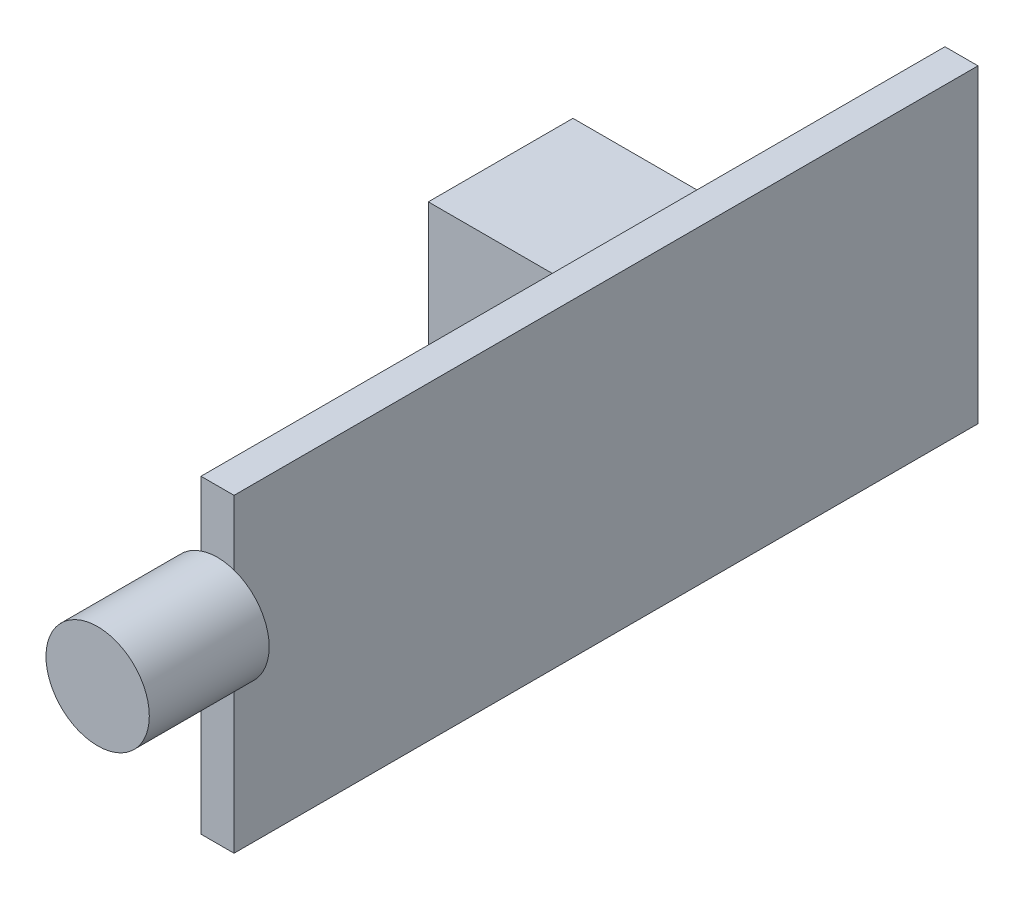
ISO-10303-21;
HEADER;
FILE_DESCRIPTION(('STEP AP214'),'2;1');
FILE_NAME('part.step','',(''),(''),'','','');
FILE_SCHEMA(('AUTOMOTIVE_DESIGN { 1 0 10303 214 1 1 1 1 }'));
ENDSEC;
DATA;
#1=APPLICATION_CONTEXT('core data for automotive mechanical design processes');
#2=APPLICATION_PROTOCOL_DEFINITION('international standard','automotive_design',2000,#1);
#3=PRODUCT_CONTEXT('',#1,'mechanical');
#4=PRODUCT('Part','Part','',(#3));
#5=PRODUCT_RELATED_PRODUCT_CATEGORY('part','',(#4));
#6=PRODUCT_DEFINITION_FORMATION('','',#4);
#7=PRODUCT_DEFINITION_CONTEXT('part definition',#1,'design');
#8=PRODUCT_DEFINITION('design','',#6,#7);
#9=PRODUCT_DEFINITION_SHAPE('','',#8);
#10=(LENGTH_UNIT() NAMED_UNIT(*) SI_UNIT(.MILLI.,.METRE.));
#11=(NAMED_UNIT(*) PLANE_ANGLE_UNIT() SI_UNIT($,.RADIAN.));
#12=(NAMED_UNIT(*) SI_UNIT($,.STERADIAN.) SOLID_ANGLE_UNIT());
#13=UNCERTAINTY_MEASURE_WITH_UNIT(LENGTH_MEASURE(1.E-05),#10,'distance_accuracy_value','');
#14=(GEOMETRIC_REPRESENTATION_CONTEXT(3) GLOBAL_UNCERTAINTY_ASSIGNED_CONTEXT((#13)) GLOBAL_UNIT_ASSIGNED_CONTEXT((#10,
#11,#12)) REPRESENTATION_CONTEXT('',''));
#15=CARTESIAN_POINT('',(0.,0.,0.));
#16=DIRECTION('',(0.,0.,1.));
#17=DIRECTION('',(1.,0.,0.));
#18=AXIS2_PLACEMENT_3D('',#15,#16,#17);
#19=CARTESIAN_POINT('',(14.2,-128.5,43.));
#20=DIRECTION('',(1.,0.,0.));
#21=DIRECTION('',(0.,0.,-1.));
#22=AXIS2_PLACEMENT_3D('',#19,#20,#21);
#23=PLANE('',#22);
#24=DIRECTION('',(0.,-1.,0.));
#25=VECTOR('',#24,1.);
#26=CARTESIAN_POINT('',(14.2,-128.5,7.));
#27=LINE('',#26,#25);
#28=CARTESIAN_POINT('',(14.2,-113.5,7.));
#29=VERTEX_POINT('',#28);
#30=CARTESIAN_POINT('',(14.2,-128.5,7.));
#31=VERTEX_POINT('',#30);
#32=EDGE_CURVE('E167',#29,#31,#27,.T.);
#33=ORIENTED_EDGE('',*,*,#32,.T.);
#34=DIRECTION('',(0.,0.,-1.));
#35=VECTOR('',#34,1.);
#36=CARTESIAN_POINT('',(14.2,-128.5,43.));
#37=LINE('',#36,#35);
#38=CARTESIAN_POINT('',(14.2,-128.5,43.));
#39=VERTEX_POINT('',#38);
#40=EDGE_CURVE('E173',#39,#31,#37,.T.);
#41=ORIENTED_EDGE('',*,*,#40,.F.);
#42=DIRECTION('',(0.,-1.,0.));
#43=VECTOR('',#42,1.);
#44=CARTESIAN_POINT('',(14.2,-128.5,43.));
#45=LINE('',#44,#43);
#46=CARTESIAN_POINT('',(14.2,-121.368543856465,43.));
#47=VERTEX_POINT('',#46);
#48=EDGE_CURVE('E155',#47,#39,#45,.T.);
#49=ORIENTED_EDGE('',*,*,#48,.F.);
#50=CARTESIAN_POINT('',(14.2,-116.631456143535,43.));
#51=VERTEX_POINT('',#50);
#52=EDGE_CURVE('E160',#51,#47,#45,.T.);
#53=ORIENTED_EDGE('',*,*,#52,.F.);
#54=CARTESIAN_POINT('',(14.2,-113.5,43.));
#55=VERTEX_POINT('',#54);
#56=EDGE_CURVE('E156',#55,#51,#45,.T.);
#57=ORIENTED_EDGE('',*,*,#56,.F.);
#58=DIRECTION('',(0.,0.,-1.));
#59=VECTOR('',#58,1.);
#60=CARTESIAN_POINT('',(14.2,-113.5,43.));
#61=LINE('',#60,#59);
#62=EDGE_CURVE('E175',#55,#29,#61,.T.);
#63=ORIENTED_EDGE('',*,*,#62,.T.);
#64=EDGE_LOOP('',(#33,#41,#49,#53,#57,#63));
#65=FACE_BOUND('',#64,.T.);
#66=DIRECTION('',(0.,1.,0.));
#67=VECTOR('',#66,1.);
#68=CARTESIAN_POINT('',(14.2,-120.5,25.));
#69=LINE('',#68,#67);
#70=CARTESIAN_POINT('',(14.2,-120.5,25.));
#71=VERTEX_POINT('',#70);
#72=CARTESIAN_POINT('',(14.2,-114.5,25.));
#73=VERTEX_POINT('',#72);
#74=EDGE_CURVE('E123',#71,#73,#69,.T.);
#75=ORIENTED_EDGE('',*,*,#74,.F.);
#76=DIRECTION('',(0.,0.,-1.));
#77=VECTOR('',#76,1.);
#78=CARTESIAN_POINT('',(14.2,-120.5,25.));
#79=LINE('',#78,#77);
#80=CARTESIAN_POINT('',(14.2,-120.5,18.));
#81=VERTEX_POINT('',#80);
#82=EDGE_CURVE('E418',#71,#81,#79,.T.);
#83=ORIENTED_EDGE('',*,*,#82,.T.);
#84=DIRECTION('',(0.,1.,0.));
#85=VECTOR('',#84,1.);
#86=CARTESIAN_POINT('',(14.2,-120.5,18.));
#87=LINE('',#86,#85);
#88=CARTESIAN_POINT('',(14.2,-114.5,18.));
#89=VERTEX_POINT('',#88);
#90=EDGE_CURVE('E136',#81,#89,#87,.T.);
#91=ORIENTED_EDGE('',*,*,#90,.T.);
#92=DIRECTION('',(0.,0.,-1.));
#93=VECTOR('',#92,1.);
#94=CARTESIAN_POINT('',(14.2,-114.5,25.));
#95=LINE('',#94,#93);
#96=EDGE_CURVE('E57',#73,#89,#95,.T.);
#97=ORIENTED_EDGE('',*,*,#96,.F.);
#98=EDGE_LOOP('',(#75,#83,#91,#97));
#99=FACE_BOUND('',#98,.T.);
#100=ADVANCED_FACE('F39',(#65,#99),#23,.F.);
#101=CARTESIAN_POINT('',(0.,0.,43.));
#102=DIRECTION('',(0.,0.,-1.));
#103=DIRECTION('',(-1.,0.,0.));
#104=AXIS2_PLACEMENT_3D('',#101,#102,#103);
#105=PLANE('',#104);
#106=CARTESIAN_POINT('',(15.,-119.,43.));
#107=DIRECTION('',(0.,0.,1.));
#108=DIRECTION('',(1.,0.,0.));
#109=AXIS2_PLACEMENT_3D('',#106,#107,#108);
#110=CIRCLE('',#109,2.5);
#111=CARTESIAN_POINT('',(15.8,-116.631456143535,43.));
#112=VERTEX_POINT('',#111);
#113=EDGE_CURVE('E49',#112,#51,#110,.T.);
#114=ORIENTED_EDGE('',*,*,#113,.F.);
#115=DIRECTION('',(0.,1.,0.));
#116=VECTOR('',#115,1.);
#117=CARTESIAN_POINT('',(15.8,-128.5,43.));
#118=LINE('',#117,#116);
#119=CARTESIAN_POINT('',(15.8,-113.5,43.));
#120=VERTEX_POINT('',#119);
#121=EDGE_CURVE('E153',#112,#120,#118,.T.);
#122=ORIENTED_EDGE('',*,*,#121,.T.);
#123=DIRECTION('',(-1.,0.,0.));
#124=VECTOR('',#123,1.);
#125=CARTESIAN_POINT('',(14.2,-113.5,43.));
#126=LINE('',#125,#124);
#127=EDGE_CURVE('E151',#120,#55,#126,.T.);
#128=ORIENTED_EDGE('',*,*,#127,.T.);
#129=ORIENTED_EDGE('',*,*,#56,.T.);
#130=EDGE_LOOP('',(#114,#122,#128,#129));
#131=FACE_BOUND('',#130,.T.);
#132=ADVANCED_FACE('F209',(#131),#105,.F.);
#133=CARTESIAN_POINT('',(15.8,-128.5,43.));
#134=DIRECTION('',(-1.,0.,0.));
#135=DIRECTION('',(0.,0.,1.));
#136=AXIS2_PLACEMENT_3D('',#133,#134,#135);
#137=PLANE('',#136);
#138=DIRECTION('',(0.,1.,0.));
#139=VECTOR('',#138,1.);
#140=CARTESIAN_POINT('',(15.8,-128.5,7.));
#141=LINE('',#140,#139);
#142=CARTESIAN_POINT('',(15.8,-128.5,7.));
#143=VERTEX_POINT('',#142);
#144=CARTESIAN_POINT('',(15.8,-113.5,7.));
#145=VERTEX_POINT('',#144);
#146=EDGE_CURVE('E146',#143,#145,#141,.T.);
#147=ORIENTED_EDGE('',*,*,#146,.T.);
#148=DIRECTION('',(0.,0.,-1.));
#149=VECTOR('',#148,1.);
#150=CARTESIAN_POINT('',(15.8,-113.5,43.));
#151=LINE('',#150,#149);
#152=EDGE_CURVE('E43',#120,#145,#151,.T.);
#153=ORIENTED_EDGE('',*,*,#152,.F.);
#154=ORIENTED_EDGE('',*,*,#121,.F.);
#155=CARTESIAN_POINT('',(15.8,-121.368543856465,43.));
#156=VERTEX_POINT('',#155);
#157=EDGE_CURVE('E152',#156,#112,#118,.T.);
#158=ORIENTED_EDGE('',*,*,#157,.F.);
#159=CARTESIAN_POINT('',(15.8,-128.5,43.));
#160=VERTEX_POINT('',#159);
#161=EDGE_CURVE('E149',#160,#156,#118,.T.);
#162=ORIENTED_EDGE('',*,*,#161,.F.);
#163=DIRECTION('',(0.,0.,-1.));
#164=VECTOR('',#163,1.);
#165=CARTESIAN_POINT('',(15.8,-128.5,43.));
#166=LINE('',#165,#164);
#167=EDGE_CURVE('E162',#160,#143,#166,.T.);
#168=ORIENTED_EDGE('',*,*,#167,.T.);
#169=EDGE_LOOP('',(#147,#153,#154,#158,#162,#168));
#170=FACE_BOUND('',#169,.T.);
#171=ADVANCED_FACE('F41',(#170),#137,.F.);
#172=CARTESIAN_POINT('',(14.2,-113.5,43.));
#173=DIRECTION('',(0.,-1.,0.));
#174=DIRECTION('',(0.,0.,-1.));
#175=AXIS2_PLACEMENT_3D('',#172,#173,#174);
#176=PLANE('',#175);
#177=DIRECTION('',(-1.,0.,0.));
#178=VECTOR('',#177,1.);
#179=CARTESIAN_POINT('',(14.2,-113.5,7.));
#180=LINE('',#179,#178);
#181=EDGE_CURVE('E165',#145,#29,#180,.T.);
#182=ORIENTED_EDGE('',*,*,#181,.T.);
#183=ORIENTED_EDGE('',*,*,#62,.F.);
#184=ORIENTED_EDGE('',*,*,#127,.F.);
#185=ORIENTED_EDGE('',*,*,#152,.T.);
#186=EDGE_LOOP('',(#182,#183,#184,#185));
#187=FACE_BOUND('',#186,.T.);
#188=ADVANCED_FACE('F185',(#187),#176,.F.);
#189=CARTESIAN_POINT('',(14.2,-128.5,43.));
#190=DIRECTION('',(0.,1.,0.));
#191=DIRECTION('',(0.,0.,1.));
#192=AXIS2_PLACEMENT_3D('',#189,#190,#191);
#193=PLANE('',#192);
#194=DIRECTION('',(1.,0.,0.));
#195=VECTOR('',#194,1.);
#196=CARTESIAN_POINT('',(14.2,-128.5,7.));
#197=LINE('',#196,#195);
#198=EDGE_CURVE('E169',#31,#143,#197,.T.);
#199=ORIENTED_EDGE('',*,*,#198,.T.);
#200=ORIENTED_EDGE('',*,*,#167,.F.);
#201=DIRECTION('',(1.,0.,0.));
#202=VECTOR('',#201,1.);
#203=CARTESIAN_POINT('',(14.2,-128.5,43.));
#204=LINE('',#203,#202);
#205=EDGE_CURVE('E159',#39,#160,#204,.T.);
#206=ORIENTED_EDGE('',*,*,#205,.F.);
#207=ORIENTED_EDGE('',*,*,#40,.T.);
#208=EDGE_LOOP('',(#199,#200,#206,#207));
#209=FACE_BOUND('',#208,.T.);
#210=ADVANCED_FACE('F197',(#209),#193,.F.);
#211=EDGE_CURVE('E11',#47,#156,#110,.T.);
#212=ORIENTED_EDGE('',*,*,#211,.F.);
#213=ORIENTED_EDGE('',*,*,#48,.T.);
#214=ORIENTED_EDGE('',*,*,#205,.T.);
#215=ORIENTED_EDGE('',*,*,#161,.T.);
#216=EDGE_LOOP('',(#212,#213,#214,#215));
#217=FACE_BOUND('',#216,.T.);
#218=ADVANCED_FACE('F198',(#217),#105,.F.);
#219=CARTESIAN_POINT('',(0.,0.,7.));
#220=DIRECTION('',(0.,0.,-1.));
#221=DIRECTION('',(-1.,0.,0.));
#222=AXIS2_PLACEMENT_3D('',#219,#220,#221);
#223=PLANE('',#222);
#224=ORIENTED_EDGE('',*,*,#146,.F.);
#225=ORIENTED_EDGE('',*,*,#198,.F.);
#226=ORIENTED_EDGE('',*,*,#32,.F.);
#227=ORIENTED_EDGE('',*,*,#181,.F.);
#228=EDGE_LOOP('',(#224,#225,#226,#227));
#229=FACE_BOUND('',#228,.T.);
#230=ADVANCED_FACE('F193',(#229),#223,.T.);
#231=CARTESIAN_POINT('',(15.,-119.,43.));
#232=DIRECTION('',(0.,0.,1.));
#233=DIRECTION('',(1.,0.,0.));
#234=AXIS2_PLACEMENT_3D('',#231,#232,#233);
#235=PLANE('',#234);
#236=EDGE_CURVE('E137',#156,#112,#110,.T.);
#237=ORIENTED_EDGE('',*,*,#236,.F.);
#238=ORIENTED_EDGE('',*,*,#157,.T.);
#239=EDGE_LOOP('',(#237,#238));
#240=FACE_BOUND('',#239,.T.);
#241=ADVANCED_FACE('F212',(#240),#235,.F.);
#242=EDGE_CURVE('E50',#51,#47,#110,.T.);
#243=ORIENTED_EDGE('',*,*,#242,.F.);
#244=ORIENTED_EDGE('',*,*,#52,.T.);
#245=EDGE_LOOP('',(#243,#244));
#246=FACE_BOUND('',#245,.T.);
#247=ADVANCED_FACE('F204',(#246),#235,.F.);
#248=CARTESIAN_POINT('',(15.,-119.,48.8));
#249=DIRECTION('',(0.,0.,-1.));
#250=DIRECTION('',(-1.,0.,0.));
#251=AXIS2_PLACEMENT_3D('',#248,#249,#250);
#252=CYLINDRICAL_SURFACE('',#251,2.5);
#253=CARTESIAN_POINT('',(15.,-119.,48.8));
#254=DIRECTION('',(0.,0.,1.));
#255=DIRECTION('',(1.,0.,0.));
#256=AXIS2_PLACEMENT_3D('',#253,#254,#255);
#257=CIRCLE('',#256,2.5);
#258=CARTESIAN_POINT('',(17.5,-119.,48.8));
#259=VERTEX_POINT('',#258);
#260=EDGE_CURVE('E144',#259,#259,#257,.T.);
#261=ORIENTED_EDGE('',*,*,#260,.F.);
#262=EDGE_LOOP('',(#261));
#263=FACE_BOUND('',#262,.T.);
#264=ORIENTED_EDGE('',*,*,#113,.T.);
#265=ORIENTED_EDGE('',*,*,#242,.T.);
#266=ORIENTED_EDGE('',*,*,#211,.T.);
#267=ORIENTED_EDGE('',*,*,#236,.T.);
#268=EDGE_LOOP('',(#264,#265,#266,#267));
#269=FACE_BOUND('',#268,.T.);
#270=ADVANCED_FACE('F206',(#263,#269),#252,.T.);
#271=CARTESIAN_POINT('',(15.,-119.,48.8));
#272=DIRECTION('',(0.,0.,1.));
#273=DIRECTION('',(1.,0.,0.));
#274=AXIS2_PLACEMENT_3D('',#271,#272,#273);
#275=PLANE('',#274);
#276=ORIENTED_EDGE('',*,*,#260,.T.);
#277=EDGE_LOOP('',(#276));
#278=FACE_BOUND('',#277,.T.);
#279=ADVANCED_FACE('F248',(#278),#275,.T.);
#280=CARTESIAN_POINT('',(7.2,-114.5,25.));
#281=DIRECTION('',(0.,-1.,0.));
#282=DIRECTION('',(0.,0.,-1.));
#283=AXIS2_PLACEMENT_3D('',#280,#281,#282);
#284=PLANE('',#283);
#285=DIRECTION('',(-1.,0.,0.));
#286=VECTOR('',#285,1.);
#287=CARTESIAN_POINT('',(7.2,-114.5,18.));
#288=LINE('',#287,#286);
#289=CARTESIAN_POINT('',(7.2,-114.5,18.));
#290=VERTEX_POINT('',#289);
#291=EDGE_CURVE('E416',#89,#290,#288,.T.);
#292=ORIENTED_EDGE('',*,*,#291,.T.);
#293=DIRECTION('',(0.,0.,-1.));
#294=VECTOR('',#293,1.);
#295=CARTESIAN_POINT('',(7.2,-114.5,25.));
#296=LINE('',#295,#294);
#297=CARTESIAN_POINT('',(7.2,-114.5,25.));
#298=VERTEX_POINT('',#297);
#299=EDGE_CURVE('E119',#298,#290,#296,.T.);
#300=ORIENTED_EDGE('',*,*,#299,.F.);
#301=DIRECTION('',(-1.,0.,0.));
#302=VECTOR('',#301,1.);
#303=CARTESIAN_POINT('',(7.2,-114.5,25.));
#304=LINE('',#303,#302);
#305=EDGE_CURVE('E115',#73,#298,#304,.T.);
#306=ORIENTED_EDGE('',*,*,#305,.F.);
#307=ORIENTED_EDGE('',*,*,#96,.T.);
#308=EDGE_LOOP('',(#292,#300,#306,#307));
#309=FACE_BOUND('',#308,.T.);
#310=ADVANCED_FACE('F117',(#309),#284,.F.);
#311=CARTESIAN_POINT('',(7.2,-120.5,25.));
#312=DIRECTION('',(1.,0.,0.));
#313=DIRECTION('',(0.,0.,-1.));
#314=AXIS2_PLACEMENT_3D('',#311,#312,#313);
#315=PLANE('',#314);
#316=DIRECTION('',(0.,-1.,0.));
#317=VECTOR('',#316,1.);
#318=CARTESIAN_POINT('',(7.2,-120.5,18.));
#319=LINE('',#318,#317);
#320=CARTESIAN_POINT('',(7.2,-120.5,18.));
#321=VERTEX_POINT('',#320);
#322=EDGE_CURVE('E413',#290,#321,#319,.T.);
#323=ORIENTED_EDGE('',*,*,#322,.T.);
#324=DIRECTION('',(0.,0.,-1.));
#325=VECTOR('',#324,1.);
#326=CARTESIAN_POINT('',(7.2,-120.5,25.));
#327=LINE('',#326,#325);
#328=CARTESIAN_POINT('',(7.2,-120.5,25.));
#329=VERTEX_POINT('',#328);
#330=EDGE_CURVE('E140',#329,#321,#327,.T.);
#331=ORIENTED_EDGE('',*,*,#330,.F.);
#332=DIRECTION('',(0.,-1.,0.));
#333=VECTOR('',#332,1.);
#334=CARTESIAN_POINT('',(7.2,-120.5,25.));
#335=LINE('',#334,#333);
#336=EDGE_CURVE('E122',#298,#329,#335,.T.);
#337=ORIENTED_EDGE('',*,*,#336,.F.);
#338=ORIENTED_EDGE('',*,*,#299,.T.);
#339=EDGE_LOOP('',(#323,#331,#337,#338));
#340=FACE_BOUND('',#339,.T.);
#341=ADVANCED_FACE('F288',(#340),#315,.F.);
#342=CARTESIAN_POINT('',(7.2,-120.5,25.));
#343=DIRECTION('',(0.,1.,0.));
#344=DIRECTION('',(0.,0.,1.));
#345=AXIS2_PLACEMENT_3D('',#342,#343,#344);
#346=PLANE('',#345);
#347=DIRECTION('',(1.,0.,0.));
#348=VECTOR('',#347,1.);
#349=CARTESIAN_POINT('',(7.2,-120.5,18.));
#350=LINE('',#349,#348);
#351=EDGE_CURVE('E132',#321,#81,#350,.T.);
#352=ORIENTED_EDGE('',*,*,#351,.T.);
#353=ORIENTED_EDGE('',*,*,#82,.F.);
#354=DIRECTION('',(1.,0.,0.));
#355=VECTOR('',#354,1.);
#356=CARTESIAN_POINT('',(7.2,-120.5,25.));
#357=LINE('',#356,#355);
#358=EDGE_CURVE('E128',#329,#71,#357,.T.);
#359=ORIENTED_EDGE('',*,*,#358,.F.);
#360=ORIENTED_EDGE('',*,*,#330,.T.);
#361=EDGE_LOOP('',(#352,#353,#359,#360));
#362=FACE_BOUND('',#361,.T.);
#363=ADVANCED_FACE('F279',(#362),#346,.F.);
#364=CARTESIAN_POINT('',(0.,0.,25.));
#365=DIRECTION('',(0.,0.,-1.));
#366=DIRECTION('',(-1.,0.,0.));
#367=AXIS2_PLACEMENT_3D('',#364,#365,#366);
#368=PLANE('',#367);
#369=ORIENTED_EDGE('',*,*,#74,.T.);
#370=ORIENTED_EDGE('',*,*,#305,.T.);
#371=ORIENTED_EDGE('',*,*,#336,.T.);
#372=ORIENTED_EDGE('',*,*,#358,.T.);
#373=EDGE_LOOP('',(#369,#370,#371,#372));
#374=FACE_BOUND('',#373,.T.);
#375=ADVANCED_FACE('F126',(#374),#368,.F.);
#376=CARTESIAN_POINT('',(0.,0.,18.));
#377=DIRECTION('',(0.,0.,-1.));
#378=DIRECTION('',(-1.,0.,0.));
#379=AXIS2_PLACEMENT_3D('',#376,#377,#378);
#380=PLANE('',#379);
#381=ORIENTED_EDGE('',*,*,#90,.F.);
#382=ORIENTED_EDGE('',*,*,#351,.F.);
#383=ORIENTED_EDGE('',*,*,#322,.F.);
#384=ORIENTED_EDGE('',*,*,#291,.F.);
#385=EDGE_LOOP('',(#381,#382,#383,#384));
#386=FACE_BOUND('',#385,.T.);
#387=ADVANCED_FACE('F265',(#386),#380,.T.);
#388=CLOSED_SHELL('',(#100,#132,#171,#188,#210,#218,#230,#241,#247,#270,#279,#310,#341,#363,
#375,#387));
#389=MANIFOLD_SOLID_BREP('B2',#388);
#390=ADVANCED_BREP_SHAPE_REPRESENTATION('',(#18,#389),#14);
#391=SHAPE_DEFINITION_REPRESENTATION(#9,#390);
ENDSEC;
END-ISO-10303-21;
